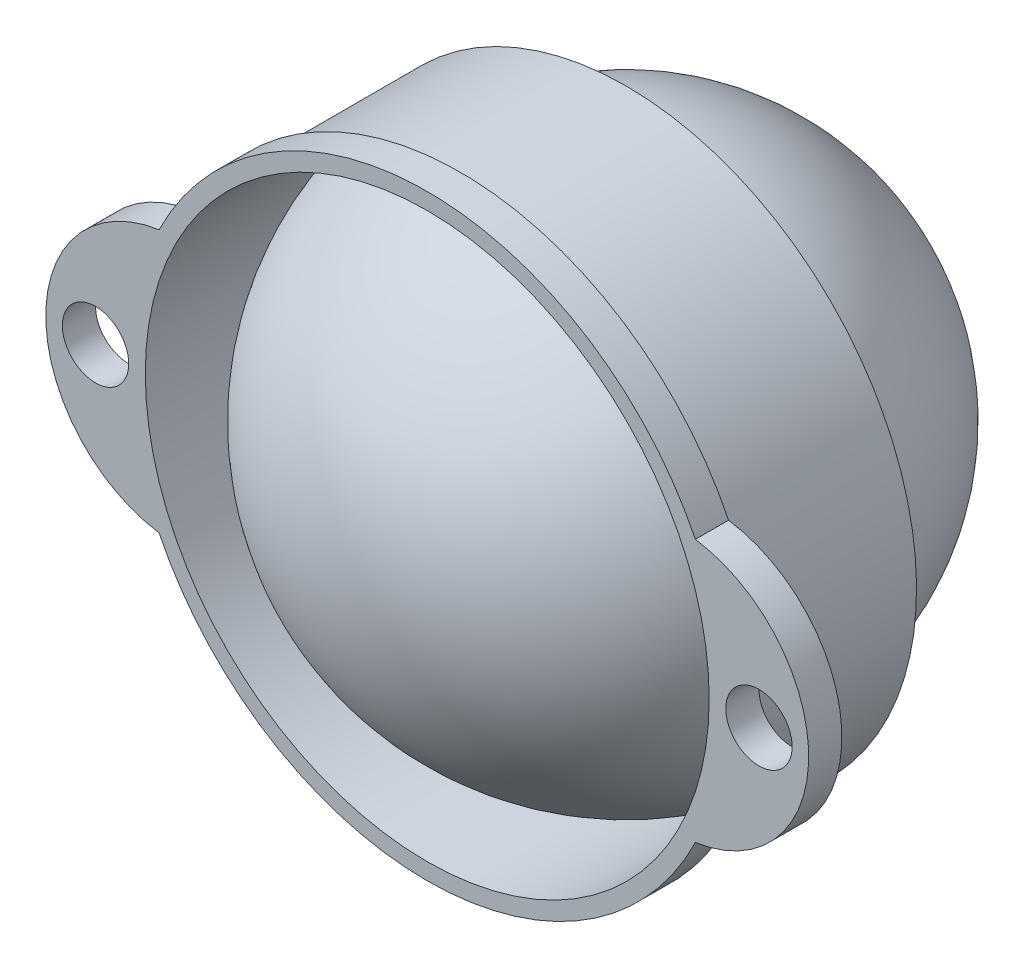
ISO-10303-21;
HEADER;
FILE_DESCRIPTION(('STEP AP214'),'2;1');
FILE_NAME('part.step','',(''),(''),'','','');
FILE_SCHEMA(('AUTOMOTIVE_DESIGN { 1 0 10303 214 1 1 1 1 }'));
ENDSEC;
DATA;
#1=APPLICATION_CONTEXT('core data for automotive mechanical design processes');
#2=APPLICATION_PROTOCOL_DEFINITION('international standard','automotive_design',2000,#1);
#3=PRODUCT_CONTEXT('',#1,'mechanical');
#4=PRODUCT('Part','Part','',(#3));
#5=PRODUCT_RELATED_PRODUCT_CATEGORY('part','',(#4));
#6=PRODUCT_DEFINITION_FORMATION('','',#4);
#7=PRODUCT_DEFINITION_CONTEXT('part definition',#1,'design');
#8=PRODUCT_DEFINITION('design','',#6,#7);
#9=PRODUCT_DEFINITION_SHAPE('','',#8);
#10=(LENGTH_UNIT() NAMED_UNIT(*) SI_UNIT(.MILLI.,.METRE.));
#11=(NAMED_UNIT(*) PLANE_ANGLE_UNIT() SI_UNIT($,.RADIAN.));
#12=(NAMED_UNIT(*) SI_UNIT($,.STERADIAN.) SOLID_ANGLE_UNIT());
#13=UNCERTAINTY_MEASURE_WITH_UNIT(LENGTH_MEASURE(1.E-05),#10,'distance_accuracy_value','');
#14=(GEOMETRIC_REPRESENTATION_CONTEXT(3) GLOBAL_UNCERTAINTY_ASSIGNED_CONTEXT((#13)) GLOBAL_UNIT_ASSIGNED_CONTEXT((#10,
#11,#12)) REPRESENTATION_CONTEXT('',''));
#15=CARTESIAN_POINT('',(0.,0.,0.));
#16=DIRECTION('',(0.,0.,1.));
#17=DIRECTION('',(1.,0.,0.));
#18=AXIS2_PLACEMENT_3D('',#15,#16,#17);
#19=CARTESIAN_POINT('',(0.,-1.32676290876039E-13,19.));
#20=DIRECTION('',(0.,0.,-1.));
#21=DIRECTION('',(0.,1.,0.));
#22=AXIS2_PLACEMENT_3D('',#19,#20,#21);
#23=CYLINDRICAL_SURFACE('',#22,17.);
#24=CARTESIAN_POINT('',(0.,0.,0.));
#25=DIRECTION('',(0.,0.,-1.));
#26=DIRECTION('',(0.,1.,0.));
#27=AXIS2_PLACEMENT_3D('',#24,#25,#26);
#28=CIRCLE('',#27,17.);
#29=CARTESIAN_POINT('',(0.,17.,1.18710365520667E-13));
#30=VERTEX_POINT('',#29);
#31=EDGE_CURVE('E109',#30,#30,#28,.T.);
#32=ORIENTED_EDGE('',*,*,#31,.T.);
#33=EDGE_LOOP('',(#32));
#34=FACE_BOUND('',#33,.T.);
#35=CARTESIAN_POINT('',(0.,0.,12.));
#36=DIRECTION('',(0.,0.,1.));
#37=DIRECTION('',(1.,0.,0.));
#38=AXIS2_PLACEMENT_3D('',#35,#36,#37);
#39=CIRCLE('',#38,16.9999999999999);
#40=CARTESIAN_POINT('',(16.9999999999999,0.,12.));
#41=VERTEX_POINT('',#40);
#42=EDGE_CURVE('E95',#41,#41,#39,.T.);
#43=ORIENTED_EDGE('',*,*,#42,.T.);
#44=EDGE_LOOP('',(#43));
#45=FACE_BOUND('',#44,.T.);
#46=ADVANCED_FACE('F46',(#34,#45),#23,.F.);
#47=CARTESIAN_POINT('',(0.,0.,0.));
#48=DIRECTION('',(0.,0.,1.));
#49=DIRECTION('',(1.,0.,0.));
#50=AXIS2_PLACEMENT_3D('',#47,#48,#49);
#51=CYLINDRICAL_SURFACE('',#50,18.);
#52=DIRECTION('',(0.,0.,1.));
#53=VECTOR('',#52,1.);
#54=CARTESIAN_POINT('',(-16.1666773806418,7.91445149522353,9.50000000000001));
#55=LINE('',#54,#53);
#56=CARTESIAN_POINT('',(-16.1666773806417,7.91445149522354,10.0000000000001));
#57=VERTEX_POINT('',#56);
#58=CARTESIAN_POINT('',(-16.1666773806418,7.91445149522347,12.));
#59=VERTEX_POINT('',#58);
#60=EDGE_CURVE('E110',#57,#59,#55,.T.);
#61=ORIENTED_EDGE('',*,*,#60,.T.);
#62=CARTESIAN_POINT('',(0.,0.,12.));
#63=DIRECTION('',(0.,0.,1.));
#64=DIRECTION('',(1.,0.,0.));
#65=AXIS2_PLACEMENT_3D('',#62,#63,#64);
#66=CIRCLE('',#65,18.);
#67=CARTESIAN_POINT('',(16.1666773806418,7.91445149522346,12.));
#68=VERTEX_POINT('',#67);
#69=EDGE_CURVE('E90',#68,#59,#66,.T.);
#70=ORIENTED_EDGE('',*,*,#69,.F.);
#71=DIRECTION('',(0.,0.,-1.));
#72=VECTOR('',#71,1.);
#73=CARTESIAN_POINT('',(16.1666773806418,7.91445149522353,9.50000000000006));
#74=LINE('',#73,#72);
#75=CARTESIAN_POINT('',(16.1666773806418,7.91445149522353,10.0000000000001));
#76=VERTEX_POINT('',#75);
#77=EDGE_CURVE('E12',#68,#76,#74,.T.);
#78=ORIENTED_EDGE('',*,*,#77,.T.);
#79=CARTESIAN_POINT('',(0.,0.,10.));
#80=DIRECTION('',(0.,0.,-1.));
#81=DIRECTION('',(0.,1.,0.));
#82=AXIS2_PLACEMENT_3D('',#79,#80,#81);
#83=CIRCLE('',#82,18.);
#84=EDGE_CURVE('E130',#57,#76,#83,.T.);
#85=ORIENTED_EDGE('',*,*,#84,.F.);
#86=EDGE_LOOP('',(#61,#70,#78,#85));
#87=FACE_BOUND('',#86,.T.);
#88=ADVANCED_FACE('F159',(#87),#51,.T.);
#89=DIRECTION('',(0.,0.,-1.));
#90=VECTOR('',#89,1.);
#91=CARTESIAN_POINT('',(16.1686592631379,-7.91040186289832,9.49999999999995));
#92=LINE('',#91,#90);
#93=CARTESIAN_POINT('',(16.1686592631379,-7.91040186289832,9.99999999999994));
#94=VERTEX_POINT('',#93);
#95=CARTESIAN_POINT('',(16.1686592631379,-7.91040186289834,12.));
#96=VERTEX_POINT('',#95);
#97=EDGE_CURVE('E55',#94,#96,#92,.F.);
#98=ORIENTED_EDGE('',*,*,#97,.T.);
#99=CARTESIAN_POINT('',(0.,0.,12.));
#100=DIRECTION('',(0.,0.,1.));
#101=DIRECTION('',(1.,0.,0.));
#102=AXIS2_PLACEMENT_3D('',#99,#100,#101);
#103=CIRCLE('',#102,18.);
#104=CARTESIAN_POINT('',(-16.1686592631379,-7.91040186289839,12.));
#105=VERTEX_POINT('',#104);
#106=EDGE_CURVE('E63',#105,#96,#103,.T.);
#107=ORIENTED_EDGE('',*,*,#106,.F.);
#108=DIRECTION('',(0.,0.,1.));
#109=VECTOR('',#108,1.);
#110=CARTESIAN_POINT('',(-16.1686592631379,-7.91040186289832,9.50000000000001));
#111=LINE('',#110,#109);
#112=CARTESIAN_POINT('',(-16.1686592631379,-7.91040186289833,9.99999999999994));
#113=VERTEX_POINT('',#112);
#114=EDGE_CURVE('E101',#105,#113,#111,.F.);
#115=ORIENTED_EDGE('',*,*,#114,.T.);
#116=CARTESIAN_POINT('',(0.,0.,10.));
#117=DIRECTION('',(0.,0.,-1.));
#118=DIRECTION('',(0.,1.,0.));
#119=AXIS2_PLACEMENT_3D('',#116,#117,#118);
#120=CIRCLE('',#119,18.);
#121=EDGE_CURVE('E123',#94,#113,#120,.T.);
#122=ORIENTED_EDGE('',*,*,#121,.F.);
#123=EDGE_LOOP('',(#98,#107,#115,#122));
#124=FACE_BOUND('',#123,.T.);
#125=ADVANCED_FACE('F99',(#124),#51,.T.);
#126=CARTESIAN_POINT('',(-20.,-1.32676290876039E-13,19.));
#127=DIRECTION('',(0.,0.,-1.));
#128=DIRECTION('',(0.,1.,0.));
#129=AXIS2_PLACEMENT_3D('',#126,#127,#128);
#130=CYLINDRICAL_SURFACE('',#129,2.);
#131=CARTESIAN_POINT('',(-20.,0.,10.));
#132=DIRECTION('',(0.,0.,-1.));
#133=DIRECTION('',(0.,1.,0.));
#134=AXIS2_PLACEMENT_3D('',#131,#132,#133);
#135=CIRCLE('',#134,2.);
#136=CARTESIAN_POINT('',(-20.,1.99999999999993,10.));
#137=VERTEX_POINT('',#136);
#138=EDGE_CURVE('E114',#137,#137,#135,.F.);
#139=ORIENTED_EDGE('',*,*,#138,.F.);
#140=EDGE_LOOP('',(#139));
#141=FACE_BOUND('',#140,.T.);
#142=CARTESIAN_POINT('',(-20.,0.,12.));
#143=DIRECTION('',(0.,0.,1.));
#144=DIRECTION('',(1.,0.,0.));
#145=AXIS2_PLACEMENT_3D('',#142,#143,#144);
#146=CIRCLE('',#145,2.);
#147=CARTESIAN_POINT('',(-18.,0.,12.));
#148=VERTEX_POINT('',#147);
#149=EDGE_CURVE('E136',#148,#148,#146,.F.);
#150=ORIENTED_EDGE('',*,*,#149,.F.);
#151=EDGE_LOOP('',(#150));
#152=FACE_BOUND('',#151,.T.);
#153=ADVANCED_FACE('F48',(#141,#152),#130,.F.);
#154=CARTESIAN_POINT('',(-15.,0.00187857901543402,19.));
#155=DIRECTION('',(0.,0.,-1.));
#156=DIRECTION('',(0.,1.,0.));
#157=AXIS2_PLACEMENT_3D('',#154,#155,#156);
#158=CYLINDRICAL_SURFACE('',#157,7.99812142098443);
#159=ORIENTED_EDGE('',*,*,#114,.F.);
#160=CARTESIAN_POINT('',(-15.,0.00187857901543382,12.));
#161=DIRECTION('',(0.,0.,1.));
#162=DIRECTION('',(1.,0.,0.));
#163=AXIS2_PLACEMENT_3D('',#160,#161,#162);
#164=CIRCLE('',#163,7.99812142098443);
#165=EDGE_CURVE('E87',#59,#105,#164,.T.);
#166=ORIENTED_EDGE('',*,*,#165,.F.);
#167=ORIENTED_EDGE('',*,*,#60,.F.);
#168=CARTESIAN_POINT('',(-15.,0.00187857901549683,10.));
#169=DIRECTION('',(0.,0.,-1.));
#170=DIRECTION('',(0.,-1.,0.));
#171=AXIS2_PLACEMENT_3D('',#168,#169,#170);
#172=CIRCLE('',#171,7.99812142098443);
#173=EDGE_CURVE('E108',#113,#57,#172,.T.);
#174=ORIENTED_EDGE('',*,*,#173,.F.);
#175=EDGE_LOOP('',(#159,#166,#167,#174));
#176=FACE_BOUND('',#175,.T.);
#177=ADVANCED_FACE('F107',(#176),#158,.T.);
#178=CARTESIAN_POINT('',(15.,0.00187857901543402,19.));
#179=DIRECTION('',(0.,0.,-1.));
#180=DIRECTION('',(0.,1.,0.));
#181=AXIS2_PLACEMENT_3D('',#178,#179,#180);
#182=CYLINDRICAL_SURFACE('',#181,7.99812142098443);
#183=CARTESIAN_POINT('',(15.,0.00187857901543382,12.));
#184=DIRECTION('',(0.,0.,1.));
#185=DIRECTION('',(-1.,0.,0.));
#186=AXIS2_PLACEMENT_3D('',#183,#184,#185);
#187=CIRCLE('',#186,7.99812142098443);
#188=EDGE_CURVE('E104',#96,#68,#187,.T.);
#189=ORIENTED_EDGE('',*,*,#188,.F.);
#190=ORIENTED_EDGE('',*,*,#97,.F.);
#191=CARTESIAN_POINT('',(15.,0.00187857901549683,10.));
#192=DIRECTION('',(0.,0.,-1.));
#193=DIRECTION('',(0.,1.,0.));
#194=AXIS2_PLACEMENT_3D('',#191,#192,#193);
#195=CIRCLE('',#194,7.99812142098443);
#196=EDGE_CURVE('E126',#76,#94,#195,.T.);
#197=ORIENTED_EDGE('',*,*,#196,.F.);
#198=ORIENTED_EDGE('',*,*,#77,.F.);
#199=EDGE_LOOP('',(#189,#190,#197,#198));
#200=FACE_BOUND('',#199,.T.);
#201=ADVANCED_FACE('F168',(#200),#182,.T.);
#202=CARTESIAN_POINT('',(20.,-1.32676290876039E-13,19.));
#203=DIRECTION('',(0.,0.,-1.));
#204=DIRECTION('',(0.,1.,0.));
#205=AXIS2_PLACEMENT_3D('',#202,#203,#204);
#206=CYLINDRICAL_SURFACE('',#205,2.);
#207=CARTESIAN_POINT('',(20.,0.,10.));
#208=DIRECTION('',(0.,0.,-1.));
#209=DIRECTION('',(0.,1.,0.));
#210=AXIS2_PLACEMENT_3D('',#207,#208,#209);
#211=CIRCLE('',#210,2.);
#212=CARTESIAN_POINT('',(20.,1.99999999999993,10.));
#213=VERTEX_POINT('',#212);
#214=EDGE_CURVE('E118',#213,#213,#211,.T.);
#215=ORIENTED_EDGE('',*,*,#214,.T.);
#216=EDGE_LOOP('',(#215));
#217=FACE_BOUND('',#216,.T.);
#218=CARTESIAN_POINT('',(20.,0.,12.));
#219=DIRECTION('',(0.,0.,1.));
#220=DIRECTION('',(1.,0.,0.));
#221=AXIS2_PLACEMENT_3D('',#218,#219,#220);
#222=CIRCLE('',#221,2.);
#223=CARTESIAN_POINT('',(22.,0.,12.));
#224=VERTEX_POINT('',#223);
#225=EDGE_CURVE('E50',#224,#224,#222,.T.);
#226=ORIENTED_EDGE('',*,*,#225,.T.);
#227=EDGE_LOOP('',(#226));
#228=FACE_BOUND('',#227,.T.);
#229=ADVANCED_FACE('F171',(#217,#228),#206,.F.);
#230=CARTESIAN_POINT('',(0.,0.,0.));
#231=DIRECTION('',(0.,0.,-1.));
#232=DIRECTION('',(0.,1.,0.));
#233=AXIS2_PLACEMENT_3D('',#230,#231,#232);
#234=PLANE('',#233);
#235=ORIENTED_EDGE('',*,*,#31,.F.);
#236=EDGE_LOOP('',(#235));
#237=FACE_BOUND('',#236,.T.);
#238=CARTESIAN_POINT('',(0.,0.,0.));
#239=DIRECTION('',(0.,0.,-1.));
#240=DIRECTION('',(0.,1.,0.));
#241=AXIS2_PLACEMENT_3D('',#238,#239,#240);
#242=CIRCLE('',#241,17.5);
#243=CARTESIAN_POINT('',(0.,17.5,1.2220184685951E-13));
#244=VERTEX_POINT('',#243);
#245=EDGE_CURVE('E133',#244,#244,#242,.T.);
#246=ORIENTED_EDGE('',*,*,#245,.T.);
#247=EDGE_LOOP('',(#246));
#248=FACE_BOUND('',#247,.T.);
#249=ADVANCED_FACE('F169',(#237,#248),#234,.T.);
#250=CARTESIAN_POINT('',(7.5,0.000939289507713502,10.));
#251=DIRECTION('',(0.,0.,-1.));
#252=DIRECTION('',(0.,1.,0.));
#253=AXIS2_PLACEMENT_3D('',#250,#251,#252);
#254=PLANE('',#253);
#255=ORIENTED_EDGE('',*,*,#214,.F.);
#256=EDGE_LOOP('',(#255));
#257=FACE_BOUND('',#256,.T.);
#258=CARTESIAN_POINT('',(0.,0.,10.));
#259=DIRECTION('',(0.,0.,-1.));
#260=DIRECTION('',(0.,1.,0.));
#261=AXIS2_PLACEMENT_3D('',#258,#259,#260);
#262=CIRCLE('',#261,17.5);
#263=CARTESIAN_POINT('',(0.,17.4999999999999,10.0000000000001));
#264=VERTEX_POINT('',#263);
#265=EDGE_CURVE('E132',#264,#264,#262,.T.);
#266=ORIENTED_EDGE('',*,*,#265,.F.);
#267=EDGE_LOOP('',(#266));
#268=FACE_BOUND('',#267,.T.);
#269=ORIENTED_EDGE('',*,*,#84,.T.);
#270=ORIENTED_EDGE('',*,*,#196,.T.);
#271=ORIENTED_EDGE('',*,*,#121,.T.);
#272=ORIENTED_EDGE('',*,*,#173,.T.);
#273=EDGE_LOOP('',(#269,#270,#271,#272));
#274=FACE_BOUND('',#273,.T.);
#275=ORIENTED_EDGE('',*,*,#138,.T.);
#276=EDGE_LOOP('',(#275));
#277=FACE_BOUND('',#276,.T.);
#278=ADVANCED_FACE('F154',(#257,#268,#274,#277),#254,.T.);
#279=CARTESIAN_POINT('',(0.,0.,10.));
#280=DIRECTION('',(0.,0.,-1.));
#281=DIRECTION('',(0.,1.,0.));
#282=AXIS2_PLACEMENT_3D('',#279,#280,#281);
#283=CYLINDRICAL_SURFACE('',#282,17.5);
#284=ORIENTED_EDGE('',*,*,#265,.T.);
#285=EDGE_LOOP('',(#284));
#286=FACE_BOUND('',#285,.T.);
#287=ORIENTED_EDGE('',*,*,#245,.F.);
#288=EDGE_LOOP('',(#287));
#289=FACE_BOUND('',#288,.T.);
#290=ADVANCED_FACE('F148',(#286,#289),#283,.T.);
#291=CARTESIAN_POINT('',(-7.5,0.000939289507716909,12.));
#292=DIRECTION('',(0.,0.,1.));
#293=DIRECTION('',(1.,0.,0.));
#294=AXIS2_PLACEMENT_3D('',#291,#292,#293);
#295=PLANE('',#294);
#296=ORIENTED_EDGE('',*,*,#225,.F.);
#297=EDGE_LOOP('',(#296));
#298=FACE_BOUND('',#297,.T.);
#299=ORIENTED_EDGE('',*,*,#165,.T.);
#300=ORIENTED_EDGE('',*,*,#106,.T.);
#301=ORIENTED_EDGE('',*,*,#188,.T.);
#302=ORIENTED_EDGE('',*,*,#69,.T.);
#303=EDGE_LOOP('',(#299,#300,#301,#302));
#304=FACE_BOUND('',#303,.T.);
#305=ORIENTED_EDGE('',*,*,#149,.T.);
#306=EDGE_LOOP('',(#305));
#307=FACE_BOUND('',#306,.T.);
#308=ORIENTED_EDGE('',*,*,#42,.F.);
#309=EDGE_LOOP('',(#308));
#310=FACE_BOUND('',#309,.T.);
#311=ADVANCED_FACE('F88',(#298,#304,#307,#310),#295,.T.);
#312=CLOSED_SHELL('',(#46,#88,#125,#153,#177,#201,#229,#249,#278,#290,#311));
#313=MANIFOLD_SOLID_BREP('B2',#312);
#314=CARTESIAN_POINT('',(0.,0.,0.));
#315=DIRECTION('',(-1.,0.,0.));
#316=DIRECTION('',(0.,-1.,0.));
#317=AXIS2_PLACEMENT_3D('',#314,#315,#316);
#318=SPHERICAL_SURFACE('',#317,17.);
#319=CARTESIAN_POINT('',(0.,0.,0.));
#320=DIRECTION('',(0.,0.,-1.));
#321=DIRECTION('',(1.,0.,0.));
#322=AXIS2_PLACEMENT_3D('',#319,#320,#321);
#323=SPHERICAL_SURFACE('',#322,17.);
#324=CARTESIAN_POINT('',(0.,0.,0.));
#325=DIRECTION('',(0.,0.,-1.));
#326=DIRECTION('',(1.,0.,0.));
#327=AXIS2_PLACEMENT_3D('',#324,#325,#326);
#328=CIRCLE('',#327,17.);
#329=CARTESIAN_POINT('',(17.,0.,0.));
#330=VERTEX_POINT('',#329);
#331=EDGE_CURVE('E45',#330,#330,#328,.T.);
#332=ORIENTED_EDGE('',*,*,#331,.F.);
#333=EDGE_LOOP('',(#332));
#334=FACE_BOUND('',#333,.T.);
#335=ADVANCED_FACE('F276',(#334),#323,.T.);
#336=CARTESIAN_POINT('',(0.,0.,0.));
#337=DIRECTION('',(0.,0.,-1.));
#338=DIRECTION('',(1.,0.,0.));
#339=AXIS2_PLACEMENT_3D('',#336,#337,#338);
#340=PLANE('',#339);
#341=ORIENTED_EDGE('',*,*,#331,.T.);
#342=EDGE_LOOP('',(#341));
#343=FACE_BOUND('',#342,.T.);
#344=CARTESIAN_POINT('',(0.,0.,0.));
#345=DIRECTION('',(0.,0.,1.));
#346=DIRECTION('',(1.,0.,0.));
#347=AXIS2_PLACEMENT_3D('',#344,#345,#346);
#348=CIRCLE('',#347,15.);
#349=CARTESIAN_POINT('',(15.,0.,0.));
#350=VERTEX_POINT('',#349);
#351=EDGE_CURVE('E283',#350,#350,#348,.T.);
#352=ORIENTED_EDGE('',*,*,#351,.T.);
#353=EDGE_LOOP('',(#352));
#354=FACE_BOUND('',#353,.T.);
#355=ADVANCED_FACE('F289',(#343,#354),#340,.T.);
#356=CARTESIAN_POINT('',(0.,0.,0.));
#357=DIRECTION('',(-1.,0.,0.));
#358=DIRECTION('',(0.,1.,0.));
#359=AXIS2_PLACEMENT_3D('',#356,#357,#358);
#360=SPHERICAL_SURFACE('',#359,15.);
#361=CARTESIAN_POINT('',(0.,0.,0.));
#362=DIRECTION('',(0.,0.,1.));
#363=DIRECTION('',(1.,0.,0.));
#364=AXIS2_PLACEMENT_3D('',#361,#362,#363);
#365=SPHERICAL_SURFACE('',#364,15.);
#366=ORIENTED_EDGE('',*,*,#351,.F.);
#367=EDGE_LOOP('',(#366));
#368=FACE_BOUND('',#367,.T.);
#369=ADVANCED_FACE('F278',(#368),#365,.T.);
#370=CLOSED_SHELL('',(#335,#355,#369));
#371=MANIFOLD_SOLID_BREP('B6',#370);
#372=ADVANCED_BREP_SHAPE_REPRESENTATION('',(#18,#313,#371),#14);
#373=SHAPE_DEFINITION_REPRESENTATION(#9,#372);
ENDSEC;
END-ISO-10303-21;
